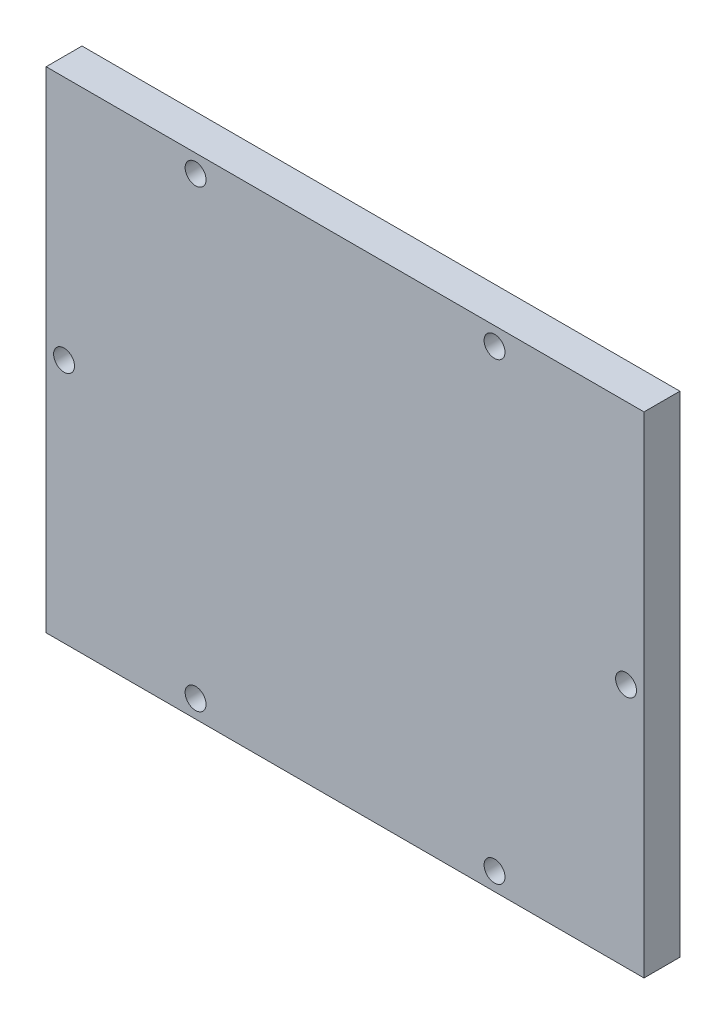
ISO-10303-21;
HEADER;
FILE_DESCRIPTION(('STEP AP214'),'2;1');
FILE_NAME('part.step','',(''),(''),'','','');
FILE_SCHEMA(('AUTOMOTIVE_DESIGN { 1 0 10303 214 1 1 1 1 }'));
ENDSEC;
DATA;
#1=APPLICATION_CONTEXT('core data for automotive mechanical design processes');
#2=APPLICATION_PROTOCOL_DEFINITION('international standard','automotive_design',2000,#1);
#3=PRODUCT_CONTEXT('',#1,'mechanical');
#4=PRODUCT('Part','Part','',(#3));
#5=PRODUCT_RELATED_PRODUCT_CATEGORY('part','',(#4));
#6=PRODUCT_DEFINITION_FORMATION('','',#4);
#7=PRODUCT_DEFINITION_CONTEXT('part definition',#1,'design');
#8=PRODUCT_DEFINITION('design','',#6,#7);
#9=PRODUCT_DEFINITION_SHAPE('','',#8);
#10=(LENGTH_UNIT() NAMED_UNIT(*) SI_UNIT(.MILLI.,.METRE.));
#11=(NAMED_UNIT(*) PLANE_ANGLE_UNIT() SI_UNIT($,.RADIAN.));
#12=(NAMED_UNIT(*) SI_UNIT($,.STERADIAN.) SOLID_ANGLE_UNIT());
#13=UNCERTAINTY_MEASURE_WITH_UNIT(LENGTH_MEASURE(1.E-05),#10,'distance_accuracy_value','');
#14=(GEOMETRIC_REPRESENTATION_CONTEXT(3) GLOBAL_UNCERTAINTY_ASSIGNED_CONTEXT((#13)) GLOBAL_UNIT_ASSIGNED_CONTEXT((#10,
#11,#12)) REPRESENTATION_CONTEXT('',''));
#15=CARTESIAN_POINT('',(0.,0.,0.));
#16=DIRECTION('',(0.,0.,1.));
#17=DIRECTION('',(1.,0.,0.));
#18=AXIS2_PLACEMENT_3D('',#15,#16,#17);
#19=CARTESIAN_POINT('',(50.,-41.,6.));
#20=DIRECTION('',(-1.,0.,0.));
#21=DIRECTION('',(0.,0.,1.));
#22=AXIS2_PLACEMENT_3D('',#19,#20,#21);
#23=PLANE('',#22);
#24=DIRECTION('',(0.,1.,0.));
#25=VECTOR('',#24,1.);
#26=CARTESIAN_POINT('',(50.,-41.,0.));
#27=LINE('',#26,#25);
#28=CARTESIAN_POINT('',(50.,-41.,0.));
#29=VERTEX_POINT('',#28);
#30=CARTESIAN_POINT('',(50.,41.,0.));
#31=VERTEX_POINT('',#30);
#32=EDGE_CURVE('E102',#29,#31,#27,.T.);
#33=ORIENTED_EDGE('',*,*,#32,.T.);
#34=DIRECTION('',(0.,0.,-1.));
#35=VECTOR('',#34,1.);
#36=CARTESIAN_POINT('',(50.,41.,6.));
#37=LINE('',#36,#35);
#38=CARTESIAN_POINT('',(50.,41.,6.));
#39=VERTEX_POINT('',#38);
#40=EDGE_CURVE('E11',#39,#31,#37,.T.);
#41=ORIENTED_EDGE('',*,*,#40,.F.);
#42=DIRECTION('',(0.,1.,0.));
#43=VECTOR('',#42,1.);
#44=CARTESIAN_POINT('',(50.,-41.,6.));
#45=LINE('',#44,#43);
#46=CARTESIAN_POINT('',(50.,-41.,6.));
#47=VERTEX_POINT('',#46);
#48=EDGE_CURVE('E90',#47,#39,#45,.T.);
#49=ORIENTED_EDGE('',*,*,#48,.F.);
#50=DIRECTION('',(0.,0.,-1.));
#51=VECTOR('',#50,1.);
#52=CARTESIAN_POINT('',(50.,-41.,6.));
#53=LINE('',#52,#51);
#54=EDGE_CURVE('E98',#47,#29,#53,.T.);
#55=ORIENTED_EDGE('',*,*,#54,.T.);
#56=EDGE_LOOP('',(#33,#41,#49,#55));
#57=FACE_BOUND('',#56,.T.);
#58=ADVANCED_FACE('F39',(#57),#23,.F.);
#59=CARTESIAN_POINT('',(-50.,41.,6.));
#60=DIRECTION('',(0.,-1.,0.));
#61=DIRECTION('',(0.,0.,-1.));
#62=AXIS2_PLACEMENT_3D('',#59,#60,#61);
#63=PLANE('',#62);
#64=DIRECTION('',(-1.,0.,0.));
#65=VECTOR('',#64,1.);
#66=CARTESIAN_POINT('',(-50.,41.,0.));
#67=LINE('',#66,#65);
#68=CARTESIAN_POINT('',(-50.,41.,0.));
#69=VERTEX_POINT('',#68);
#70=EDGE_CURVE('E94',#31,#69,#67,.T.);
#71=ORIENTED_EDGE('',*,*,#70,.T.);
#72=DIRECTION('',(0.,0.,-1.));
#73=VECTOR('',#72,1.);
#74=CARTESIAN_POINT('',(-50.,41.,6.));
#75=LINE('',#74,#73);
#76=CARTESIAN_POINT('',(-50.,41.,6.));
#77=VERTEX_POINT('',#76);
#78=EDGE_CURVE('E47',#77,#69,#75,.T.);
#79=ORIENTED_EDGE('',*,*,#78,.F.);
#80=DIRECTION('',(-1.,0.,0.));
#81=VECTOR('',#80,1.);
#82=CARTESIAN_POINT('',(-50.,41.,6.));
#83=LINE('',#82,#81);
#84=EDGE_CURVE('E85',#39,#77,#83,.T.);
#85=ORIENTED_EDGE('',*,*,#84,.F.);
#86=ORIENTED_EDGE('',*,*,#40,.T.);
#87=EDGE_LOOP('',(#71,#79,#85,#86));
#88=FACE_BOUND('',#87,.T.);
#89=ADVANCED_FACE('F93',(#88),#63,.F.);
#90=CARTESIAN_POINT('',(-50.,-41.,6.));
#91=DIRECTION('',(1.,0.,0.));
#92=DIRECTION('',(0.,0.,-1.));
#93=AXIS2_PLACEMENT_3D('',#90,#91,#92);
#94=PLANE('',#93);
#95=DIRECTION('',(0.,-1.,0.));
#96=VECTOR('',#95,1.);
#97=CARTESIAN_POINT('',(-50.,-41.,0.));
#98=LINE('',#97,#96);
#99=CARTESIAN_POINT('',(-50.,-41.,0.));
#100=VERTEX_POINT('',#99);
#101=EDGE_CURVE('E72',#69,#100,#98,.T.);
#102=ORIENTED_EDGE('',*,*,#101,.T.);
#103=DIRECTION('',(0.,0.,-1.));
#104=VECTOR('',#103,1.);
#105=CARTESIAN_POINT('',(-50.,-41.,6.));
#106=LINE('',#105,#104);
#107=CARTESIAN_POINT('',(-50.,-41.,6.));
#108=VERTEX_POINT('',#107);
#109=EDGE_CURVE('E95',#108,#100,#106,.T.);
#110=ORIENTED_EDGE('',*,*,#109,.F.);
#111=DIRECTION('',(0.,-1.,0.));
#112=VECTOR('',#111,1.);
#113=CARTESIAN_POINT('',(-50.,-41.,6.));
#114=LINE('',#113,#112);
#115=EDGE_CURVE('E88',#77,#108,#114,.T.);
#116=ORIENTED_EDGE('',*,*,#115,.F.);
#117=ORIENTED_EDGE('',*,*,#78,.T.);
#118=EDGE_LOOP('',(#102,#110,#116,#117));
#119=FACE_BOUND('',#118,.T.);
#120=ADVANCED_FACE('F96',(#119),#94,.F.);
#121=CARTESIAN_POINT('',(-50.,-41.,6.));
#122=DIRECTION('',(0.,1.,0.));
#123=DIRECTION('',(0.,0.,1.));
#124=AXIS2_PLACEMENT_3D('',#121,#122,#123);
#125=PLANE('',#124);
#126=DIRECTION('',(1.,0.,0.));
#127=VECTOR('',#126,1.);
#128=CARTESIAN_POINT('',(-50.,-41.,0.));
#129=LINE('',#128,#127);
#130=EDGE_CURVE('E78',#100,#29,#129,.T.);
#131=ORIENTED_EDGE('',*,*,#130,.T.);
#132=ORIENTED_EDGE('',*,*,#54,.F.);
#133=DIRECTION('',(1.,0.,0.));
#134=VECTOR('',#133,1.);
#135=CARTESIAN_POINT('',(-50.,-41.,6.));
#136=LINE('',#135,#134);
#137=EDGE_CURVE('E55',#108,#47,#136,.T.);
#138=ORIENTED_EDGE('',*,*,#137,.F.);
#139=ORIENTED_EDGE('',*,*,#109,.T.);
#140=EDGE_LOOP('',(#131,#132,#138,#139));
#141=FACE_BOUND('',#140,.T.);
#142=ADVANCED_FACE('F110',(#141),#125,.F.);
#143=CARTESIAN_POINT('',(0.,0.,6.));
#144=DIRECTION('',(0.,0.,-1.));
#145=DIRECTION('',(-1.,0.,0.));
#146=AXIS2_PLACEMENT_3D('',#143,#144,#145);
#147=PLANE('',#146);
#148=CARTESIAN_POINT('',(-47.,0.,6.));
#149=DIRECTION('',(0.,0.,-1.));
#150=DIRECTION('',(-1.,0.,0.));
#151=AXIS2_PLACEMENT_3D('',#148,#149,#150);
#152=CIRCLE('',#151,1.75);
#153=CARTESIAN_POINT('',(-48.75,0.,6.));
#154=VERTEX_POINT('',#153);
#155=EDGE_CURVE('E145',#154,#154,#152,.F.);
#156=ORIENTED_EDGE('',*,*,#155,.F.);
#157=EDGE_LOOP('',(#156));
#158=FACE_BOUND('',#157,.T.);
#159=CARTESIAN_POINT('',(47.,0.,6.));
#160=DIRECTION('',(0.,0.,-1.));
#161=DIRECTION('',(-1.,0.,0.));
#162=AXIS2_PLACEMENT_3D('',#159,#160,#161);
#163=CIRCLE('',#162,1.75);
#164=CARTESIAN_POINT('',(45.25,0.,6.));
#165=VERTEX_POINT('',#164);
#166=EDGE_CURVE('E139',#165,#165,#163,.T.);
#167=ORIENTED_EDGE('',*,*,#166,.T.);
#168=EDGE_LOOP('',(#167));
#169=FACE_BOUND('',#168,.T.);
#170=CARTESIAN_POINT('',(25.,-38.,6.));
#171=DIRECTION('',(0.,0.,-1.));
#172=DIRECTION('',(-1.,0.,0.));
#173=AXIS2_PLACEMENT_3D('',#170,#171,#172);
#174=CIRCLE('',#173,1.75);
#175=CARTESIAN_POINT('',(23.25,-38.,6.));
#176=VERTEX_POINT('',#175);
#177=EDGE_CURVE('E125',#176,#176,#174,.T.);
#178=ORIENTED_EDGE('',*,*,#177,.T.);
#179=EDGE_LOOP('',(#178));
#180=FACE_BOUND('',#179,.T.);
#181=CARTESIAN_POINT('',(-25.,38.,6.));
#182=DIRECTION('',(0.,0.,-1.));
#183=DIRECTION('',(-1.,0.,0.));
#184=AXIS2_PLACEMENT_3D('',#181,#182,#183);
#185=CIRCLE('',#184,1.75);
#186=CARTESIAN_POINT('',(-26.75,38.,6.));
#187=VERTEX_POINT('',#186);
#188=EDGE_CURVE('E126',#187,#187,#185,.T.);
#189=ORIENTED_EDGE('',*,*,#188,.T.);
#190=EDGE_LOOP('',(#189));
#191=FACE_BOUND('',#190,.T.);
#192=CARTESIAN_POINT('',(25.,38.,6.));
#193=DIRECTION('',(0.,0.,-1.));
#194=DIRECTION('',(-1.,0.,0.));
#195=AXIS2_PLACEMENT_3D('',#192,#193,#194);
#196=CIRCLE('',#195,1.75);
#197=CARTESIAN_POINT('',(23.25,38.,6.));
#198=VERTEX_POINT('',#197);
#199=EDGE_CURVE('E136',#198,#198,#196,.T.);
#200=ORIENTED_EDGE('',*,*,#199,.T.);
#201=EDGE_LOOP('',(#200));
#202=FACE_BOUND('',#201,.T.);
#203=CARTESIAN_POINT('',(-25.,-38.,6.));
#204=DIRECTION('',(0.,0.,-1.));
#205=DIRECTION('',(-1.,0.,0.));
#206=AXIS2_PLACEMENT_3D('',#203,#204,#205);
#207=CIRCLE('',#206,1.75);
#208=CARTESIAN_POINT('',(-26.75,-38.,6.));
#209=VERTEX_POINT('',#208);
#210=EDGE_CURVE('E105',#209,#209,#207,.T.);
#211=ORIENTED_EDGE('',*,*,#210,.T.);
#212=EDGE_LOOP('',(#211));
#213=FACE_BOUND('',#212,.T.);
#214=ORIENTED_EDGE('',*,*,#48,.T.);
#215=ORIENTED_EDGE('',*,*,#84,.T.);
#216=ORIENTED_EDGE('',*,*,#115,.T.);
#217=ORIENTED_EDGE('',*,*,#137,.T.);
#218=EDGE_LOOP('',(#214,#215,#216,#217));
#219=FACE_BOUND('',#218,.T.);
#220=ADVANCED_FACE('F86',(#158,#169,#180,#191,#202,#213,#219),#147,.F.);
#221=CARTESIAN_POINT('',(0.,0.,0.));
#222=DIRECTION('',(0.,0.,-1.));
#223=DIRECTION('',(-1.,0.,0.));
#224=AXIS2_PLACEMENT_3D('',#221,#222,#223);
#225=PLANE('',#224);
#226=CARTESIAN_POINT('',(-47.,0.,0.));
#227=DIRECTION('',(0.,0.,-1.));
#228=DIRECTION('',(-1.,0.,0.));
#229=AXIS2_PLACEMENT_3D('',#226,#227,#228);
#230=CIRCLE('',#229,1.75);
#231=CARTESIAN_POINT('',(-48.75,0.,0.));
#232=VERTEX_POINT('',#231);
#233=EDGE_CURVE('E148',#232,#232,#230,.T.);
#234=ORIENTED_EDGE('',*,*,#233,.F.);
#235=EDGE_LOOP('',(#234));
#236=FACE_BOUND('',#235,.T.);
#237=CARTESIAN_POINT('',(47.,0.,0.));
#238=DIRECTION('',(0.,0.,1.));
#239=DIRECTION('',(1.,0.,0.));
#240=AXIS2_PLACEMENT_3D('',#237,#238,#239);
#241=CIRCLE('',#240,1.75);
#242=CARTESIAN_POINT('',(45.25,0.,0.));
#243=VERTEX_POINT('',#242);
#244=EDGE_CURVE('E142',#243,#243,#241,.T.);
#245=ORIENTED_EDGE('',*,*,#244,.T.);
#246=EDGE_LOOP('',(#245));
#247=FACE_BOUND('',#246,.T.);
#248=CARTESIAN_POINT('',(25.,-38.,0.));
#249=DIRECTION('',(0.,0.,1.));
#250=DIRECTION('',(1.,0.,0.));
#251=AXIS2_PLACEMENT_3D('',#248,#249,#250);
#252=CIRCLE('',#251,1.75);
#253=CARTESIAN_POINT('',(26.75,-38.,0.));
#254=VERTEX_POINT('',#253);
#255=EDGE_CURVE('E121',#254,#254,#252,.T.);
#256=ORIENTED_EDGE('',*,*,#255,.T.);
#257=EDGE_LOOP('',(#256));
#258=FACE_BOUND('',#257,.T.);
#259=CARTESIAN_POINT('',(-25.,38.,0.));
#260=DIRECTION('',(0.,0.,1.));
#261=DIRECTION('',(1.,0.,0.));
#262=AXIS2_PLACEMENT_3D('',#259,#260,#261);
#263=CIRCLE('',#262,1.75);
#264=CARTESIAN_POINT('',(-23.25,38.,0.));
#265=VERTEX_POINT('',#264);
#266=EDGE_CURVE('E122',#265,#265,#263,.T.);
#267=ORIENTED_EDGE('',*,*,#266,.T.);
#268=EDGE_LOOP('',(#267));
#269=FACE_BOUND('',#268,.T.);
#270=CARTESIAN_POINT('',(25.,38.,0.));
#271=DIRECTION('',(0.,0.,1.));
#272=DIRECTION('',(1.,0.,0.));
#273=AXIS2_PLACEMENT_3D('',#270,#271,#272);
#274=CIRCLE('',#273,1.75);
#275=CARTESIAN_POINT('',(26.75,38.,0.));
#276=VERTEX_POINT('',#275);
#277=EDGE_CURVE('E129',#276,#276,#274,.T.);
#278=ORIENTED_EDGE('',*,*,#277,.T.);
#279=EDGE_LOOP('',(#278));
#280=FACE_BOUND('',#279,.T.);
#281=CARTESIAN_POINT('',(-25.,-38.,0.));
#282=DIRECTION('',(0.,0.,1.));
#283=DIRECTION('',(1.,0.,0.));
#284=AXIS2_PLACEMENT_3D('',#281,#282,#283);
#285=CIRCLE('',#284,1.75);
#286=CARTESIAN_POINT('',(-23.25,-38.,0.));
#287=VERTEX_POINT('',#286);
#288=EDGE_CURVE('E118',#287,#287,#285,.T.);
#289=ORIENTED_EDGE('',*,*,#288,.T.);
#290=EDGE_LOOP('',(#289));
#291=FACE_BOUND('',#290,.T.);
#292=ORIENTED_EDGE('',*,*,#32,.F.);
#293=ORIENTED_EDGE('',*,*,#130,.F.);
#294=ORIENTED_EDGE('',*,*,#101,.F.);
#295=ORIENTED_EDGE('',*,*,#70,.F.);
#296=EDGE_LOOP('',(#292,#293,#294,#295));
#297=FACE_BOUND('',#296,.T.);
#298=ADVANCED_FACE('F113',(#236,#247,#258,#269,#280,#291,#297),#225,.T.);
#299=CARTESIAN_POINT('',(-25.,-38.,10.9497474683058));
#300=DIRECTION('',(0.,0.,-1.));
#301=DIRECTION('',(-1.,0.,0.));
#302=AXIS2_PLACEMENT_3D('',#299,#300,#301);
#303=CYLINDRICAL_SURFACE('',#302,1.75);
#304=ORIENTED_EDGE('',*,*,#210,.F.);
#305=EDGE_LOOP('',(#304));
#306=FACE_BOUND('',#305,.T.);
#307=ORIENTED_EDGE('',*,*,#288,.F.);
#308=EDGE_LOOP('',(#307));
#309=FACE_BOUND('',#308,.T.);
#310=ADVANCED_FACE('F156',(#306,#309),#303,.F.);
#311=CARTESIAN_POINT('',(25.,38.,10.9497474683058));
#312=DIRECTION('',(0.,0.,-1.));
#313=DIRECTION('',(-1.,0.,0.));
#314=AXIS2_PLACEMENT_3D('',#311,#312,#313);
#315=CYLINDRICAL_SURFACE('',#314,1.75);
#316=ORIENTED_EDGE('',*,*,#199,.F.);
#317=EDGE_LOOP('',(#316));
#318=FACE_BOUND('',#317,.T.);
#319=ORIENTED_EDGE('',*,*,#277,.F.);
#320=EDGE_LOOP('',(#319));
#321=FACE_BOUND('',#320,.T.);
#322=ADVANCED_FACE('F169',(#318,#321),#315,.F.);
#323=CARTESIAN_POINT('',(-25.,38.,10.9497474683058));
#324=DIRECTION('',(0.,0.,-1.));
#325=DIRECTION('',(-1.,0.,0.));
#326=AXIS2_PLACEMENT_3D('',#323,#324,#325);
#327=CYLINDRICAL_SURFACE('',#326,1.75);
#328=ORIENTED_EDGE('',*,*,#188,.F.);
#329=EDGE_LOOP('',(#328));
#330=FACE_BOUND('',#329,.T.);
#331=ORIENTED_EDGE('',*,*,#266,.F.);
#332=EDGE_LOOP('',(#331));
#333=FACE_BOUND('',#332,.T.);
#334=ADVANCED_FACE('F175',(#330,#333),#327,.F.);
#335=CARTESIAN_POINT('',(25.,-38.,10.9497474683058));
#336=DIRECTION('',(0.,0.,-1.));
#337=DIRECTION('',(-1.,0.,0.));
#338=AXIS2_PLACEMENT_3D('',#335,#336,#337);
#339=CYLINDRICAL_SURFACE('',#338,1.75);
#340=ORIENTED_EDGE('',*,*,#177,.F.);
#341=EDGE_LOOP('',(#340));
#342=FACE_BOUND('',#341,.T.);
#343=ORIENTED_EDGE('',*,*,#255,.F.);
#344=EDGE_LOOP('',(#343));
#345=FACE_BOUND('',#344,.T.);
#346=ADVANCED_FACE('F209',(#342,#345),#339,.F.);
#347=CARTESIAN_POINT('',(47.,0.,10.9497474683058));
#348=DIRECTION('',(0.,0.,-1.));
#349=DIRECTION('',(-1.,0.,0.));
#350=AXIS2_PLACEMENT_3D('',#347,#348,#349);
#351=CYLINDRICAL_SURFACE('',#350,1.75);
#352=CARTESIAN_POINT('',(45.25,0.,6.));
#353=CARTESIAN_POINT('',(45.25,0.,5.9375));
#354=CARTESIAN_POINT('',(45.25,0.,5.875));
#355=CARTESIAN_POINT('',(45.25,0.,5.75));
#356=CARTESIAN_POINT('',(45.25,0.,5.6875));
#357=CARTESIAN_POINT('',(45.25,0.,5.5625));
#358=CARTESIAN_POINT('',(45.25,0.,5.5));
#359=CARTESIAN_POINT('',(45.25,0.,5.375));
#360=CARTESIAN_POINT('',(45.25,0.,5.3125));
#361=CARTESIAN_POINT('',(45.25,0.,5.1875));
#362=CARTESIAN_POINT('',(45.25,0.,5.125));
#363=CARTESIAN_POINT('',(45.25,0.,5.));
#364=CARTESIAN_POINT('',(45.25,0.,4.9375));
#365=CARTESIAN_POINT('',(45.25,0.,4.8125));
#366=CARTESIAN_POINT('',(45.25,0.,4.75));
#367=CARTESIAN_POINT('',(45.25,0.,4.625));
#368=CARTESIAN_POINT('',(45.25,0.,4.5625));
#369=CARTESIAN_POINT('',(45.25,0.,4.4375));
#370=CARTESIAN_POINT('',(45.25,0.,4.375));
#371=CARTESIAN_POINT('',(45.25,0.,4.25));
#372=CARTESIAN_POINT('',(45.25,0.,4.1875));
#373=CARTESIAN_POINT('',(45.25,0.,4.0625));
#374=CARTESIAN_POINT('',(45.25,0.,4.));
#375=CARTESIAN_POINT('',(45.25,0.,3.875));
#376=CARTESIAN_POINT('',(45.25,0.,3.8125));
#377=CARTESIAN_POINT('',(45.25,0.,3.6875));
#378=CARTESIAN_POINT('',(45.25,0.,3.625));
#379=CARTESIAN_POINT('',(45.25,0.,3.5));
#380=CARTESIAN_POINT('',(45.25,0.,3.4375));
#381=CARTESIAN_POINT('',(45.25,0.,3.3125));
#382=CARTESIAN_POINT('',(45.25,0.,3.25));
#383=CARTESIAN_POINT('',(45.25,0.,3.125));
#384=CARTESIAN_POINT('',(45.25,0.,3.0625));
#385=CARTESIAN_POINT('',(45.25,0.,2.9375));
#386=CARTESIAN_POINT('',(45.25,0.,2.875));
#387=CARTESIAN_POINT('',(45.25,0.,2.75));
#388=CARTESIAN_POINT('',(45.25,0.,2.6875));
#389=CARTESIAN_POINT('',(45.25,0.,2.5625));
#390=CARTESIAN_POINT('',(45.25,0.,2.5));
#391=CARTESIAN_POINT('',(45.25,0.,2.375));
#392=CARTESIAN_POINT('',(45.25,0.,2.3125));
#393=CARTESIAN_POINT('',(45.25,0.,2.1875));
#394=CARTESIAN_POINT('',(45.25,0.,2.125));
#395=CARTESIAN_POINT('',(45.25,0.,2.));
#396=CARTESIAN_POINT('',(45.25,0.,1.9375));
#397=CARTESIAN_POINT('',(45.25,0.,1.8125));
#398=CARTESIAN_POINT('',(45.25,0.,1.75));
#399=CARTESIAN_POINT('',(45.25,0.,1.625));
#400=CARTESIAN_POINT('',(45.25,0.,1.5625));
#401=CARTESIAN_POINT('',(45.25,0.,1.4375));
#402=CARTESIAN_POINT('',(45.25,0.,1.375));
#403=CARTESIAN_POINT('',(45.25,0.,1.25));
#404=CARTESIAN_POINT('',(45.25,0.,1.1875));
#405=CARTESIAN_POINT('',(45.25,0.,1.0625));
#406=CARTESIAN_POINT('',(45.25,0.,1.));
#407=CARTESIAN_POINT('',(45.25,0.,0.875000000000001));
#408=CARTESIAN_POINT('',(45.25,0.,0.812500000000001));
#409=CARTESIAN_POINT('',(45.25,0.,0.687500000000001));
#410=CARTESIAN_POINT('',(45.25,0.,0.625000000000001));
#411=CARTESIAN_POINT('',(45.25,0.,0.5));
#412=CARTESIAN_POINT('',(45.25,0.,0.4375));
#413=CARTESIAN_POINT('',(45.25,0.,0.3125));
#414=CARTESIAN_POINT('',(45.25,0.,0.25));
#415=CARTESIAN_POINT('',(45.25,0.,0.125));
#416=CARTESIAN_POINT('',(45.25,0.,0.0625000000000001));
#417=CARTESIAN_POINT('',(45.25,0.,0.));
#418=B_SPLINE_CURVE_WITH_KNOTS('',3,(#352,#353,#354,#355,#356,#357,#358,#359,#360,#361,#362,
#363,#364,#365,#366,#367,#368,#369,#370,#371,#372,#373,#374,#375,#376,#377,#378,#379,#380,#381,
#382,#383,#384,#385,#386,#387,#388,#389,#390,#391,#392,#393,#394,#395,#396,#397,#398,#399,#400,
#401,#402,#403,#404,#405,#406,#407,#408,#409,#410,#411,#412,#413,#414,#415,#416,#417),
.UNSPECIFIED.,.F.,.F.,(4,2,2,2,2,2,2,2,2,2,2,2,2,2,2,2,2,2,2,2,2,2,2,2,2,2,2,2,2,2,2,2,4),(0.,
0.1875,0.375,0.5625,0.750000000000001,0.9375,1.125,1.3125,1.5,1.6875,1.875,2.0625,2.25,2.4375,
2.625,2.8125,3.,3.1875,3.375,3.5625,3.75,3.9375,4.125,4.3125,4.5,4.6875,4.875,5.0625,5.25,
5.4375,5.625,5.8125,6.),.UNSPECIFIED.);
#419=EDGE_CURVE('BSEAM213',#165,#243,#418,.T.);
#420=ORIENTED_EDGE('',*,*,#166,.F.);
#421=ORIENTED_EDGE('',*,*,#244,.F.);
#422=ORIENTED_EDGE('',*,*,#419,.T.);
#423=ORIENTED_EDGE('',*,*,#419,.F.);
#424=EDGE_LOOP('',(#420,#422,#421,#423));
#425=FACE_BOUND('',#424,.T.);
#426=ADVANCED_FACE('F213',(#425),#351,.F.);
#427=CARTESIAN_POINT('',(-47.,0.,10.9497474683058));
#428=DIRECTION('',(0.,0.,-1.));
#429=DIRECTION('',(-1.,0.,0.));
#430=AXIS2_PLACEMENT_3D('',#427,#428,#429);
#431=CYLINDRICAL_SURFACE('',#430,1.75);
#432=CARTESIAN_POINT('',(-48.75,0.,6.));
#433=CARTESIAN_POINT('',(-48.75,0.,5.9375));
#434=CARTESIAN_POINT('',(-48.75,0.,5.875));
#435=CARTESIAN_POINT('',(-48.75,0.,5.75));
#436=CARTESIAN_POINT('',(-48.75,0.,5.6875));
#437=CARTESIAN_POINT('',(-48.75,0.,5.5625));
#438=CARTESIAN_POINT('',(-48.75,0.,5.5));
#439=CARTESIAN_POINT('',(-48.75,0.,5.375));
#440=CARTESIAN_POINT('',(-48.75,0.,5.3125));
#441=CARTESIAN_POINT('',(-48.75,0.,5.1875));
#442=CARTESIAN_POINT('',(-48.75,0.,5.125));
#443=CARTESIAN_POINT('',(-48.75,0.,5.));
#444=CARTESIAN_POINT('',(-48.75,0.,4.9375));
#445=CARTESIAN_POINT('',(-48.75,0.,4.8125));
#446=CARTESIAN_POINT('',(-48.75,0.,4.75));
#447=CARTESIAN_POINT('',(-48.75,0.,4.625));
#448=CARTESIAN_POINT('',(-48.75,0.,4.5625));
#449=CARTESIAN_POINT('',(-48.75,0.,4.4375));
#450=CARTESIAN_POINT('',(-48.75,0.,4.375));
#451=CARTESIAN_POINT('',(-48.75,0.,4.25));
#452=CARTESIAN_POINT('',(-48.75,0.,4.1875));
#453=CARTESIAN_POINT('',(-48.75,0.,4.0625));
#454=CARTESIAN_POINT('',(-48.75,0.,4.));
#455=CARTESIAN_POINT('',(-48.75,0.,3.875));
#456=CARTESIAN_POINT('',(-48.75,0.,3.8125));
#457=CARTESIAN_POINT('',(-48.75,0.,3.6875));
#458=CARTESIAN_POINT('',(-48.75,0.,3.625));
#459=CARTESIAN_POINT('',(-48.75,0.,3.5));
#460=CARTESIAN_POINT('',(-48.75,0.,3.4375));
#461=CARTESIAN_POINT('',(-48.75,0.,3.3125));
#462=CARTESIAN_POINT('',(-48.75,0.,3.25));
#463=CARTESIAN_POINT('',(-48.75,0.,3.125));
#464=CARTESIAN_POINT('',(-48.75,0.,3.0625));
#465=CARTESIAN_POINT('',(-48.75,0.,2.9375));
#466=CARTESIAN_POINT('',(-48.75,0.,2.875));
#467=CARTESIAN_POINT('',(-48.75,0.,2.75));
#468=CARTESIAN_POINT('',(-48.75,0.,2.6875));
#469=CARTESIAN_POINT('',(-48.75,0.,2.5625));
#470=CARTESIAN_POINT('',(-48.75,0.,2.5));
#471=CARTESIAN_POINT('',(-48.75,0.,2.375));
#472=CARTESIAN_POINT('',(-48.75,0.,2.3125));
#473=CARTESIAN_POINT('',(-48.75,0.,2.1875));
#474=CARTESIAN_POINT('',(-48.75,0.,2.125));
#475=CARTESIAN_POINT('',(-48.75,0.,2.));
#476=CARTESIAN_POINT('',(-48.75,0.,1.9375));
#477=CARTESIAN_POINT('',(-48.75,0.,1.8125));
#478=CARTESIAN_POINT('',(-48.75,0.,1.75));
#479=CARTESIAN_POINT('',(-48.75,0.,1.625));
#480=CARTESIAN_POINT('',(-48.75,0.,1.5625));
#481=CARTESIAN_POINT('',(-48.75,0.,1.4375));
#482=CARTESIAN_POINT('',(-48.75,0.,1.375));
#483=CARTESIAN_POINT('',(-48.75,0.,1.25));
#484=CARTESIAN_POINT('',(-48.75,0.,1.1875));
#485=CARTESIAN_POINT('',(-48.75,0.,1.0625));
#486=CARTESIAN_POINT('',(-48.75,0.,1.));
#487=CARTESIAN_POINT('',(-48.75,0.,0.875000000000001));
#488=CARTESIAN_POINT('',(-48.75,0.,0.812500000000001));
#489=CARTESIAN_POINT('',(-48.75,0.,0.687500000000001));
#490=CARTESIAN_POINT('',(-48.75,0.,0.625000000000001));
#491=CARTESIAN_POINT('',(-48.75,0.,0.5));
#492=CARTESIAN_POINT('',(-48.75,0.,0.4375));
#493=CARTESIAN_POINT('',(-48.75,0.,0.3125));
#494=CARTESIAN_POINT('',(-48.75,0.,0.25));
#495=CARTESIAN_POINT('',(-48.75,0.,0.125));
#496=CARTESIAN_POINT('',(-48.75,0.,0.0625000000000001));
#497=CARTESIAN_POINT('',(-48.75,0.,0.));
#498=B_SPLINE_CURVE_WITH_KNOTS('',3,(#432,#433,#434,#435,#436,#437,#438,#439,#440,#441,#442,
#443,#444,#445,#446,#447,#448,#449,#450,#451,#452,#453,#454,#455,#456,#457,#458,#459,#460,#461,
#462,#463,#464,#465,#466,#467,#468,#469,#470,#471,#472,#473,#474,#475,#476,#477,#478,#479,#480,
#481,#482,#483,#484,#485,#486,#487,#488,#489,#490,#491,#492,#493,#494,#495,#496,#497),
.UNSPECIFIED.,.F.,.F.,(4,2,2,2,2,2,2,2,2,2,2,2,2,2,2,2,2,2,2,2,2,2,2,2,2,2,2,2,2,2,2,2,4),(0.,
0.1875,0.375,0.5625,0.750000000000001,0.9375,1.125,1.3125,1.5,1.6875,1.875,2.0625,2.25,2.4375,
2.625,2.8125,3.,3.1875,3.375,3.5625,3.75,3.9375,4.125,4.3125,4.5,4.6875,4.875,5.0625,5.25,
5.4375,5.625,5.8125,6.),.UNSPECIFIED.);
#499=EDGE_CURVE('BSEAM152',#154,#232,#498,.T.);
#500=ORIENTED_EDGE('',*,*,#155,.T.);
#501=ORIENTED_EDGE('',*,*,#233,.T.);
#502=ORIENTED_EDGE('',*,*,#499,.T.);
#503=ORIENTED_EDGE('',*,*,#499,.F.);
#504=EDGE_LOOP('',(#500,#502,#501,#503));
#505=FACE_BOUND('',#504,.T.);
#506=ADVANCED_FACE('F152',(#505),#431,.F.);
#507=CLOSED_SHELL('',(#58,#89,#120,#142,#220,#298,#310,#322,#334,#346,#426,#506));
#508=MANIFOLD_SOLID_BREP('B2',#507);
#509=ADVANCED_BREP_SHAPE_REPRESENTATION('',(#18,#508),#14);
#510=SHAPE_DEFINITION_REPRESENTATION(#9,#509);
ENDSEC;
END-ISO-10303-21;
